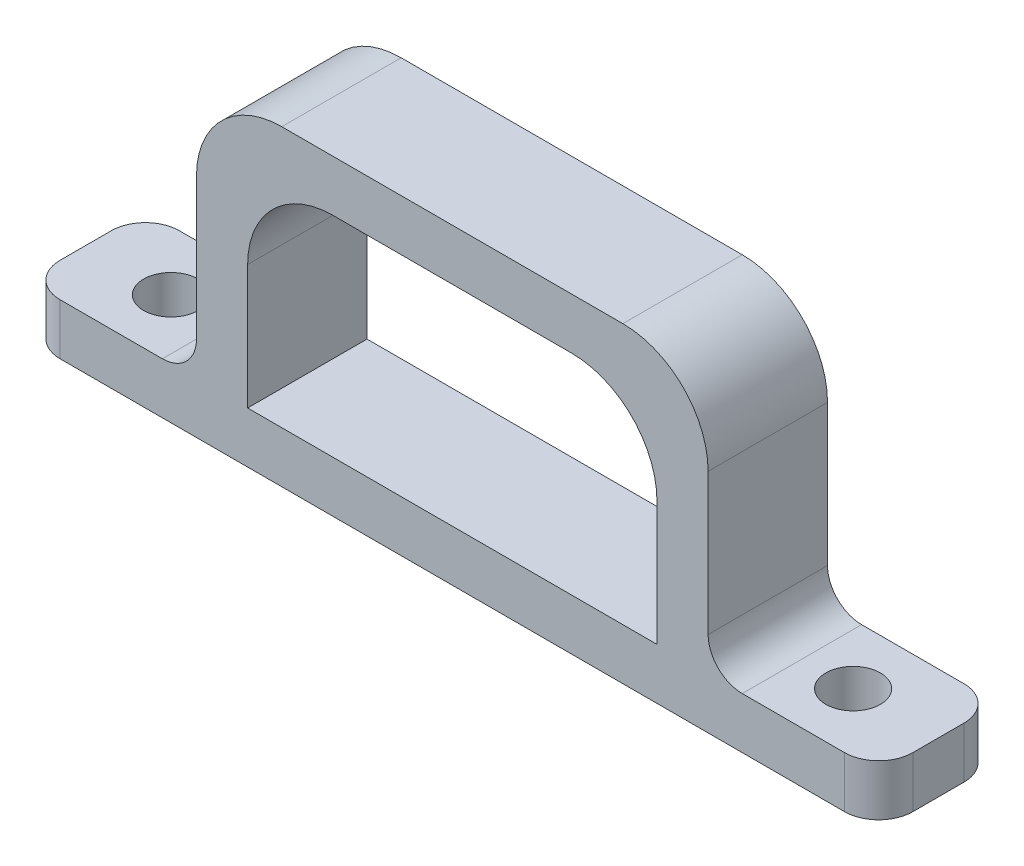
ISO-10303-21;
HEADER;
FILE_DESCRIPTION(('STEP AP214'),'2;1');
FILE_NAME('part.step','',(''),(''),'','','');
FILE_SCHEMA(('AUTOMOTIVE_DESIGN { 1 0 10303 214 1 1 1 1 }'));
ENDSEC;
DATA;
#1=APPLICATION_CONTEXT('core data for automotive mechanical design processes');
#2=APPLICATION_PROTOCOL_DEFINITION('international standard','automotive_design',2000,#1);
#3=PRODUCT_CONTEXT('',#1,'mechanical');
#4=PRODUCT('Part','Part','',(#3));
#5=PRODUCT_RELATED_PRODUCT_CATEGORY('part','',(#4));
#6=PRODUCT_DEFINITION_FORMATION('','',#4);
#7=PRODUCT_DEFINITION_CONTEXT('part definition',#1,'design');
#8=PRODUCT_DEFINITION('design','',#6,#7);
#9=PRODUCT_DEFINITION_SHAPE('','',#8);
#10=(LENGTH_UNIT() NAMED_UNIT(*) SI_UNIT(.MILLI.,.METRE.));
#11=(NAMED_UNIT(*) PLANE_ANGLE_UNIT() SI_UNIT($,.RADIAN.));
#12=(NAMED_UNIT(*) SI_UNIT($,.STERADIAN.) SOLID_ANGLE_UNIT());
#13=UNCERTAINTY_MEASURE_WITH_UNIT(LENGTH_MEASURE(1.E-05),#10,'distance_accuracy_value','');
#14=(GEOMETRIC_REPRESENTATION_CONTEXT(3) GLOBAL_UNCERTAINTY_ASSIGNED_CONTEXT((#13)) GLOBAL_UNIT_ASSIGNED_CONTEXT((#10,
#11,#12)) REPRESENTATION_CONTEXT('',''));
#15=CARTESIAN_POINT('',(0.,0.,0.));
#16=DIRECTION('',(0.,0.,1.));
#17=DIRECTION('',(1.,0.,0.));
#18=AXIS2_PLACEMENT_3D('',#15,#16,#17);
#19=CARTESIAN_POINT('',(0.,-1.5,7.));
#20=DIRECTION('',(0.,1.,0.));
#21=DIRECTION('',(0.,0.,1.));
#22=AXIS2_PLACEMENT_3D('',#19,#20,#21);
#23=PLANE('',#22);
#24=CARTESIAN_POINT('',(-20.,-1.5,3.5));
#25=DIRECTION('',(0.,1.,0.));
#26=DIRECTION('',(0.,0.,1.));
#27=AXIS2_PLACEMENT_3D('',#24,#25,#26);
#28=CIRCLE('',#27,1.6);
#29=CARTESIAN_POINT('',(-20.,-1.5,5.1));
#30=VERTEX_POINT('',#29);
#31=EDGE_CURVE('E731',#30,#30,#28,.T.);
#32=ORIENTED_EDGE('',*,*,#31,.T.);
#33=EDGE_LOOP('',(#32));
#34=FACE_BOUND('',#33,.T.);
#35=CARTESIAN_POINT('',(20.,-1.5,3.5));
#36=DIRECTION('',(0.,1.,0.));
#37=DIRECTION('',(0.,0.,1.));
#38=AXIS2_PLACEMENT_3D('',#35,#36,#37);
#39=CIRCLE('',#38,1.6);
#40=CARTESIAN_POINT('',(20.,-1.5,5.1));
#41=VERTEX_POINT('',#40);
#42=EDGE_CURVE('E267',#41,#41,#39,.T.);
#43=ORIENTED_EDGE('',*,*,#42,.T.);
#44=EDGE_LOOP('',(#43));
#45=FACE_BOUND('',#44,.T.);
#46=DIRECTION('',(1.,0.,0.));
#47=VECTOR('',#46,1.);
#48=CARTESIAN_POINT('',(0.,-1.5,0.));
#49=LINE('',#48,#47);
#50=CARTESIAN_POINT('',(-23.,-1.5,0.));
#51=VERTEX_POINT('',#50);
#52=CARTESIAN_POINT('',(23.,-1.5,0.));
#53=VERTEX_POINT('',#52);
#54=EDGE_CURVE('E278',#51,#53,#49,.T.);
#55=ORIENTED_EDGE('',*,*,#54,.T.);
#56=CARTESIAN_POINT('',(23.,-1.5,2.));
#57=DIRECTION('',(0.,1.,0.));
#58=DIRECTION('',(0.,0.,1.));
#59=AXIS2_PLACEMENT_3D('',#56,#57,#58);
#60=CIRCLE('',#59,2.);
#61=CARTESIAN_POINT('',(25.,-1.5,2.));
#62=VERTEX_POINT('',#61);
#63=EDGE_CURVE('E393',#53,#62,#60,.F.);
#64=ORIENTED_EDGE('',*,*,#63,.T.);
#65=DIRECTION('',(0.,0.,-1.));
#66=VECTOR('',#65,1.);
#67=CARTESIAN_POINT('',(25.,-1.5,7.));
#68=LINE('',#67,#66);
#69=CARTESIAN_POINT('',(25.,-1.5,5.));
#70=VERTEX_POINT('',#69);
#71=EDGE_CURVE('E301',#70,#62,#68,.T.);
#72=ORIENTED_EDGE('',*,*,#71,.F.);
#73=CARTESIAN_POINT('',(23.,-1.5,5.));
#74=DIRECTION('',(0.,1.,0.));
#75=DIRECTION('',(0.,0.,1.));
#76=AXIS2_PLACEMENT_3D('',#73,#74,#75);
#77=CIRCLE('',#76,2.);
#78=CARTESIAN_POINT('',(23.,-1.5,7.));
#79=VERTEX_POINT('',#78);
#80=EDGE_CURVE('E390',#70,#79,#77,.F.);
#81=ORIENTED_EDGE('',*,*,#80,.T.);
#82=DIRECTION('',(1.,0.,0.));
#83=VECTOR('',#82,1.);
#84=CARTESIAN_POINT('',(0.,-1.5,7.));
#85=LINE('',#84,#83);
#86=CARTESIAN_POINT('',(-23.,-1.5,7.));
#87=VERTEX_POINT('',#86);
#88=EDGE_CURVE('E244',#87,#79,#85,.T.);
#89=ORIENTED_EDGE('',*,*,#88,.F.);
#90=CARTESIAN_POINT('',(-23.,-1.5,5.));
#91=DIRECTION('',(0.,1.,0.));
#92=DIRECTION('',(0.,0.,1.));
#93=AXIS2_PLACEMENT_3D('',#90,#91,#92);
#94=CIRCLE('',#93,2.);
#95=CARTESIAN_POINT('',(-25.,-1.5,5.));
#96=VERTEX_POINT('',#95);
#97=EDGE_CURVE('E384',#87,#96,#94,.F.);
#98=ORIENTED_EDGE('',*,*,#97,.T.);
#99=DIRECTION('',(0.,0.,-1.));
#100=VECTOR('',#99,1.);
#101=CARTESIAN_POINT('',(-25.,-1.5,7.));
#102=LINE('',#101,#100);
#103=CARTESIAN_POINT('',(-25.,-1.5,2.));
#104=VERTEX_POINT('',#103);
#105=EDGE_CURVE('E210',#96,#104,#102,.T.);
#106=ORIENTED_EDGE('',*,*,#105,.T.);
#107=CARTESIAN_POINT('',(-23.,-1.5,2.));
#108=DIRECTION('',(0.,1.,0.));
#109=DIRECTION('',(0.,0.,1.));
#110=AXIS2_PLACEMENT_3D('',#107,#108,#109);
#111=CIRCLE('',#110,2.);
#112=EDGE_CURVE('E387',#104,#51,#111,.F.);
#113=ORIENTED_EDGE('',*,*,#112,.T.);
#114=EDGE_LOOP('',(#55,#64,#72,#81,#89,#98,#106,#113));
#115=FACE_BOUND('',#114,.T.);
#116=ADVANCED_FACE('F47',(#34,#45,#115),#23,.F.);
#117=CARTESIAN_POINT('',(25.,0.,7.));
#118=DIRECTION('',(-1.,0.,0.));
#119=DIRECTION('',(0.,0.,1.));
#120=AXIS2_PLACEMENT_3D('',#117,#118,#119);
#121=PLANE('',#120);
#122=ORIENTED_EDGE('',*,*,#71,.T.);
#123=DIRECTION('',(0.,1.,0.));
#124=VECTOR('',#123,1.);
#125=CARTESIAN_POINT('',(25.,0.,2.));
#126=LINE('',#125,#124);
#127=CARTESIAN_POINT('',(25.,1.5,2.));
#128=VERTEX_POINT('',#127);
#129=EDGE_CURVE('E364',#62,#128,#126,.T.);
#130=ORIENTED_EDGE('',*,*,#129,.T.);
#131=DIRECTION('',(0.,0.,-1.));
#132=VECTOR('',#131,1.);
#133=CARTESIAN_POINT('',(25.,1.5,7.));
#134=LINE('',#133,#132);
#135=CARTESIAN_POINT('',(25.,1.5,5.));
#136=VERTEX_POINT('',#135);
#137=EDGE_CURVE('E297',#136,#128,#134,.T.);
#138=ORIENTED_EDGE('',*,*,#137,.F.);
#139=DIRECTION('',(0.,1.,0.));
#140=VECTOR('',#139,1.);
#141=CARTESIAN_POINT('',(25.,-1.5,5.));
#142=LINE('',#141,#140);
#143=EDGE_CURVE('E361',#136,#70,#142,.F.);
#144=ORIENTED_EDGE('',*,*,#143,.T.);
#145=EDGE_LOOP('',(#122,#130,#138,#144));
#146=FACE_BOUND('',#145,.T.);
#147=ADVANCED_FACE('F464',(#146),#121,.F.);
#148=CARTESIAN_POINT('',(0.,1.5,7.));
#149=DIRECTION('',(0.,1.,0.));
#150=DIRECTION('',(0.,0.,1.));
#151=AXIS2_PLACEMENT_3D('',#148,#149,#150);
#152=PLANE('',#151);
#153=CARTESIAN_POINT('',(20.,1.5,3.5));
#154=DIRECTION('',(0.,1.,0.));
#155=DIRECTION('',(0.,0.,1.));
#156=AXIS2_PLACEMENT_3D('',#153,#154,#155);
#157=CIRCLE('',#156,1.6);
#158=CARTESIAN_POINT('',(20.,1.5,5.1));
#159=VERTEX_POINT('',#158);
#160=EDGE_CURVE('E714',#159,#159,#157,.T.);
#161=ORIENTED_EDGE('',*,*,#160,.F.);
#162=EDGE_LOOP('',(#161));
#163=FACE_BOUND('',#162,.T.);
#164=ORIENTED_EDGE('',*,*,#137,.T.);
#165=CARTESIAN_POINT('',(23.,1.5,2.));
#166=DIRECTION('',(0.,1.,0.));
#167=DIRECTION('',(0.,0.,1.));
#168=AXIS2_PLACEMENT_3D('',#165,#166,#167);
#169=CIRCLE('',#168,2.);
#170=CARTESIAN_POINT('',(23.,1.5,0.));
#171=VERTEX_POINT('',#170);
#172=EDGE_CURVE('E374',#128,#171,#169,.T.);
#173=ORIENTED_EDGE('',*,*,#172,.T.);
#174=DIRECTION('',(1.,0.,0.));
#175=VECTOR('',#174,1.);
#176=CARTESIAN_POINT('',(0.,1.5,0.));
#177=LINE('',#176,#175);
#178=CARTESIAN_POINT('',(17.,1.5,0.));
#179=VERTEX_POINT('',#178);
#180=EDGE_CURVE('E236',#179,#171,#177,.T.);
#181=ORIENTED_EDGE('',*,*,#180,.F.);
#182=DIRECTION('',(0.,0.,-1.));
#183=VECTOR('',#182,1.);
#184=CARTESIAN_POINT('',(17.,1.5,7.));
#185=LINE('',#184,#183);
#186=CARTESIAN_POINT('',(17.,1.5,7.));
#187=VERTEX_POINT('',#186);
#188=EDGE_CURVE('E368',#179,#187,#185,.F.);
#189=ORIENTED_EDGE('',*,*,#188,.T.);
#190=DIRECTION('',(1.,0.,0.));
#191=VECTOR('',#190,1.);
#192=CARTESIAN_POINT('',(0.,1.5,7.));
#193=LINE('',#192,#191);
#194=CARTESIAN_POINT('',(23.,1.5,7.));
#195=VERTEX_POINT('',#194);
#196=EDGE_CURVE('E231',#187,#195,#193,.T.);
#197=ORIENTED_EDGE('',*,*,#196,.T.);
#198=CARTESIAN_POINT('',(23.,1.5,5.));
#199=DIRECTION('',(0.,1.,0.));
#200=DIRECTION('',(0.,0.,1.));
#201=AXIS2_PLACEMENT_3D('',#198,#199,#200);
#202=CIRCLE('',#201,2.);
#203=EDGE_CURVE('E371',#195,#136,#202,.T.);
#204=ORIENTED_EDGE('',*,*,#203,.T.);
#205=EDGE_LOOP('',(#164,#173,#181,#189,#197,#204));
#206=FACE_BOUND('',#205,.T.);
#207=ADVANCED_FACE('F481',(#163,#206),#152,.T.);
#208=CARTESIAN_POINT('',(15.,0.,7.));
#209=DIRECTION('',(-1.,0.,0.));
#210=DIRECTION('',(0.,-1.,0.));
#211=AXIS2_PLACEMENT_3D('',#208,#209,#210);
#212=PLANE('',#211);
#213=DIRECTION('',(0.,1.,0.));
#214=VECTOR('',#213,1.);
#215=CARTESIAN_POINT('',(15.,0.,7.));
#216=LINE('',#215,#214);
#217=CARTESIAN_POINT('',(15.,3.5,7.));
#218=VERTEX_POINT('',#217);
#219=CARTESIAN_POINT('',(15.,11.7835913944263,7.));
#220=VERTEX_POINT('',#219);
#221=EDGE_CURVE('E243',#218,#220,#216,.T.);
#222=ORIENTED_EDGE('',*,*,#221,.F.);
#223=DIRECTION('',(0.,0.,-1.));
#224=VECTOR('',#223,1.);
#225=CARTESIAN_POINT('',(15.,3.5,7.));
#226=LINE('',#225,#224);
#227=CARTESIAN_POINT('',(15.,3.5,0.));
#228=VERTEX_POINT('',#227);
#229=EDGE_CURVE('E402',#218,#228,#226,.T.);
#230=ORIENTED_EDGE('',*,*,#229,.T.);
#231=DIRECTION('',(0.,1.,0.));
#232=VECTOR('',#231,1.);
#233=CARTESIAN_POINT('',(15.,0.,0.));
#234=LINE('',#233,#232);
#235=CARTESIAN_POINT('',(15.,11.7835913944263,0.));
#236=VERTEX_POINT('',#235);
#237=EDGE_CURVE('E282',#228,#236,#234,.T.);
#238=ORIENTED_EDGE('',*,*,#237,.T.);
#239=DIRECTION('',(0.,0.,-1.));
#240=VECTOR('',#239,1.);
#241=CARTESIAN_POINT('',(15.,11.7835913944263,7.));
#242=LINE('',#241,#240);
#243=EDGE_CURVE('E334',#236,#220,#242,.F.);
#244=ORIENTED_EDGE('',*,*,#243,.T.);
#245=EDGE_LOOP('',(#222,#230,#238,#244));
#246=FACE_BOUND('',#245,.T.);
#247=ADVANCED_FACE('F661',(#246),#212,.F.);
#248=CARTESIAN_POINT('',(0.,16.7835913944263,7.));
#249=DIRECTION('',(0.,1.,0.));
#250=DIRECTION('',(0.,0.,1.));
#251=AXIS2_PLACEMENT_3D('',#248,#249,#250);
#252=PLANE('',#251);
#253=DIRECTION('',(1.,0.,0.));
#254=VECTOR('',#253,1.);
#255=CARTESIAN_POINT('',(0.,16.7835913944263,7.));
#256=LINE('',#255,#254);
#257=CARTESIAN_POINT('',(-10.,16.7835913944263,7.));
#258=VERTEX_POINT('',#257);
#259=CARTESIAN_POINT('',(10.,16.7835913944263,7.));
#260=VERTEX_POINT('',#259);
#261=EDGE_CURVE('E249',#258,#260,#256,.T.);
#262=ORIENTED_EDGE('',*,*,#261,.T.);
#263=DIRECTION('',(0.,0.,-1.));
#264=VECTOR('',#263,1.);
#265=CARTESIAN_POINT('',(10.,16.7835913944263,0.));
#266=LINE('',#265,#264);
#267=CARTESIAN_POINT('',(10.,16.7835913944263,0.));
#268=VERTEX_POINT('',#267);
#269=EDGE_CURVE('E323',#260,#268,#266,.T.);
#270=ORIENTED_EDGE('',*,*,#269,.T.);
#271=DIRECTION('',(1.,0.,0.));
#272=VECTOR('',#271,1.);
#273=CARTESIAN_POINT('',(0.,16.7835913944263,0.));
#274=LINE('',#273,#272);
#275=CARTESIAN_POINT('',(-10.,16.7835913944263,0.));
#276=VERTEX_POINT('',#275);
#277=EDGE_CURVE('E285',#276,#268,#274,.T.);
#278=ORIENTED_EDGE('',*,*,#277,.F.);
#279=DIRECTION('',(0.,0.,-1.));
#280=VECTOR('',#279,1.);
#281=CARTESIAN_POINT('',(-10.,16.7835913944263,7.));
#282=LINE('',#281,#280);
#283=EDGE_CURVE('E320',#276,#258,#282,.F.);
#284=ORIENTED_EDGE('',*,*,#283,.T.);
#285=EDGE_LOOP('',(#262,#270,#278,#284));
#286=FACE_BOUND('',#285,.T.);
#287=ADVANCED_FACE('F653',(#286),#252,.T.);
#288=CARTESIAN_POINT('',(-15.,0.,7.));
#289=DIRECTION('',(-1.,0.,0.));
#290=DIRECTION('',(0.,0.,1.));
#291=AXIS2_PLACEMENT_3D('',#288,#289,#290);
#292=PLANE('',#291);
#293=DIRECTION('',(0.,1.,0.));
#294=VECTOR('',#293,1.);
#295=CARTESIAN_POINT('',(-15.,0.,0.));
#296=LINE('',#295,#294);
#297=CARTESIAN_POINT('',(-15.,3.5,0.));
#298=VERTEX_POINT('',#297);
#299=CARTESIAN_POINT('',(-15.,11.7835913944263,0.));
#300=VERTEX_POINT('',#299);
#301=EDGE_CURVE('E234',#298,#300,#296,.T.);
#302=ORIENTED_EDGE('',*,*,#301,.F.);
#303=DIRECTION('',(0.,0.,-1.));
#304=VECTOR('',#303,1.);
#305=CARTESIAN_POINT('',(-15.,3.5,7.));
#306=LINE('',#305,#304);
#307=CARTESIAN_POINT('',(-15.,3.5,7.));
#308=VERTEX_POINT('',#307);
#309=EDGE_CURVE('E414',#298,#308,#306,.F.);
#310=ORIENTED_EDGE('',*,*,#309,.T.);
#311=DIRECTION('',(0.,1.,0.));
#312=VECTOR('',#311,1.);
#313=CARTESIAN_POINT('',(-15.,0.,7.));
#314=LINE('',#313,#312);
#315=CARTESIAN_POINT('',(-15.,11.7835913944263,7.));
#316=VERTEX_POINT('',#315);
#317=EDGE_CURVE('E240',#308,#316,#314,.T.);
#318=ORIENTED_EDGE('',*,*,#317,.T.);
#319=DIRECTION('',(0.,0.,-1.));
#320=VECTOR('',#319,1.);
#321=CARTESIAN_POINT('',(-15.,11.7835913944263,7.));
#322=LINE('',#321,#320);
#323=EDGE_CURVE('E345',#316,#300,#322,.T.);
#324=ORIENTED_EDGE('',*,*,#323,.T.);
#325=EDGE_LOOP('',(#302,#310,#318,#324));
#326=FACE_BOUND('',#325,.T.);
#327=ADVANCED_FACE('F438',(#326),#292,.T.);
#328=CARTESIAN_POINT('',(-20.,1.5,3.5));
#329=DIRECTION('',(0.,1.,0.));
#330=DIRECTION('',(0.,0.,1.));
#331=AXIS2_PLACEMENT_3D('',#328,#329,#330);
#332=CIRCLE('',#331,1.6);
#333=CARTESIAN_POINT('',(-20.,1.5,5.1));
#334=VERTEX_POINT('',#333);
#335=EDGE_CURVE('E733',#334,#334,#332,.T.);
#336=ORIENTED_EDGE('',*,*,#335,.F.);
#337=EDGE_LOOP('',(#336));
#338=FACE_BOUND('',#337,.T.);
#339=CARTESIAN_POINT('',(-23.,1.5,7.));
#340=VERTEX_POINT('',#339);
#341=CARTESIAN_POINT('',(-17.,1.5,7.));
#342=VERTEX_POINT('',#341);
#343=EDGE_CURVE('E230',#340,#342,#193,.T.);
#344=ORIENTED_EDGE('',*,*,#343,.T.);
#345=DIRECTION('',(0.,0.,-1.));
#346=VECTOR('',#345,1.);
#347=CARTESIAN_POINT('',(-17.,1.5,0.));
#348=LINE('',#347,#346);
#349=CARTESIAN_POINT('',(-17.,1.5,0.));
#350=VERTEX_POINT('',#349);
#351=EDGE_CURVE('E410',#342,#350,#348,.T.);
#352=ORIENTED_EDGE('',*,*,#351,.T.);
#353=CARTESIAN_POINT('',(-23.,1.5,0.));
#354=VERTEX_POINT('',#353);
#355=EDGE_CURVE('E228',#354,#350,#177,.T.);
#356=ORIENTED_EDGE('',*,*,#355,.F.);
#357=CARTESIAN_POINT('',(-23.,1.5,2.));
#358=DIRECTION('',(0.,1.,0.));
#359=DIRECTION('',(0.,0.,1.));
#360=AXIS2_PLACEMENT_3D('',#357,#358,#359);
#361=CIRCLE('',#360,2.);
#362=CARTESIAN_POINT('',(-25.,1.5,2.));
#363=VERTEX_POINT('',#362);
#364=EDGE_CURVE('E63',#354,#363,#361,.T.);
#365=ORIENTED_EDGE('',*,*,#364,.T.);
#366=DIRECTION('',(0.,0.,-1.));
#367=VECTOR('',#366,1.);
#368=CARTESIAN_POINT('',(-25.,1.5,7.));
#369=LINE('',#368,#367);
#370=CARTESIAN_POINT('',(-25.,1.5,5.));
#371=VERTEX_POINT('',#370);
#372=EDGE_CURVE('E294',#371,#363,#369,.T.);
#373=ORIENTED_EDGE('',*,*,#372,.F.);
#374=CARTESIAN_POINT('',(-23.,1.5,5.));
#375=DIRECTION('',(0.,1.,0.));
#376=DIRECTION('',(0.,0.,1.));
#377=AXIS2_PLACEMENT_3D('',#374,#375,#376);
#378=CIRCLE('',#377,2.);
#379=EDGE_CURVE('E71',#371,#340,#378,.T.);
#380=ORIENTED_EDGE('',*,*,#379,.T.);
#381=EDGE_LOOP('',(#344,#352,#356,#365,#373,#380));
#382=FACE_BOUND('',#381,.T.);
#383=ADVANCED_FACE('F444',(#338,#382),#152,.T.);
#384=CARTESIAN_POINT('',(-12.,1.5,0.));
#385=VERTEX_POINT('',#384);
#386=CARTESIAN_POINT('',(12.,1.5,0.));
#387=VERTEX_POINT('',#386);
#388=EDGE_CURVE('E205',#385,#387,#177,.T.);
#389=ORIENTED_EDGE('',*,*,#388,.F.);
#390=DIRECTION('',(0.,0.,-1.));
#391=VECTOR('',#390,1.);
#392=CARTESIAN_POINT('',(-12.,1.5,7.));
#393=LINE('',#392,#391);
#394=CARTESIAN_POINT('',(-12.,1.5,7.));
#395=VERTEX_POINT('',#394);
#396=EDGE_CURVE('E198',#395,#385,#393,.T.);
#397=ORIENTED_EDGE('',*,*,#396,.F.);
#398=CARTESIAN_POINT('',(12.,1.5,7.));
#399=VERTEX_POINT('',#398);
#400=EDGE_CURVE('E202',#395,#399,#193,.T.);
#401=ORIENTED_EDGE('',*,*,#400,.T.);
#402=DIRECTION('',(0.,0.,-1.));
#403=VECTOR('',#402,1.);
#404=CARTESIAN_POINT('',(12.,1.5,7.));
#405=LINE('',#404,#403);
#406=EDGE_CURVE('E211',#399,#387,#405,.T.);
#407=ORIENTED_EDGE('',*,*,#406,.T.);
#408=EDGE_LOOP('',(#389,#397,#401,#407));
#409=FACE_BOUND('',#408,.T.);
#410=ADVANCED_FACE('F200',(#409),#152,.T.);
#411=CARTESIAN_POINT('',(-12.,0.,7.));
#412=DIRECTION('',(-1.,0.,0.));
#413=DIRECTION('',(0.,0.,1.));
#414=AXIS2_PLACEMENT_3D('',#411,#412,#413);
#415=PLANE('',#414);
#416=DIRECTION('',(0.,1.,0.));
#417=VECTOR('',#416,1.);
#418=CARTESIAN_POINT('',(-12.,0.,0.));
#419=LINE('',#418,#417);
#420=CARTESIAN_POINT('',(-12.,8.78359139442625,0.));
#421=VERTEX_POINT('',#420);
#422=EDGE_CURVE('E266',#385,#421,#419,.T.);
#423=ORIENTED_EDGE('',*,*,#422,.T.);
#424=DIRECTION('',(0.,0.,-1.));
#425=VECTOR('',#424,1.);
#426=CARTESIAN_POINT('',(-12.,8.78359139442625,7.));
#427=LINE('',#426,#425);
#428=CARTESIAN_POINT('',(-12.,8.78359139442625,7.));
#429=VERTEX_POINT('',#428);
#430=EDGE_CURVE('E217',#421,#429,#427,.F.);
#431=ORIENTED_EDGE('',*,*,#430,.T.);
#432=DIRECTION('',(0.,1.,0.));
#433=VECTOR('',#432,1.);
#434=CARTESIAN_POINT('',(-12.,0.,7.));
#435=LINE('',#434,#433);
#436=EDGE_CURVE('E214',#395,#429,#435,.T.);
#437=ORIENTED_EDGE('',*,*,#436,.F.);
#438=ORIENTED_EDGE('',*,*,#396,.T.);
#439=EDGE_LOOP('',(#423,#431,#437,#438));
#440=FACE_BOUND('',#439,.T.);
#441=ADVANCED_FACE('F215',(#440),#415,.F.);
#442=CARTESIAN_POINT('',(0.,13.7835913944263,7.));
#443=DIRECTION('',(0.,1.,0.));
#444=DIRECTION('',(0.,0.,1.));
#445=AXIS2_PLACEMENT_3D('',#442,#443,#444);
#446=PLANE('',#445);
#447=DIRECTION('',(1.,0.,0.));
#448=VECTOR('',#447,1.);
#449=CARTESIAN_POINT('',(0.,13.7835913944263,7.));
#450=LINE('',#449,#448);
#451=CARTESIAN_POINT('',(-7.,13.7835913944263,7.));
#452=VERTEX_POINT('',#451);
#453=CARTESIAN_POINT('',(7.,13.7835913944263,7.));
#454=VERTEX_POINT('',#453);
#455=EDGE_CURVE('E221',#452,#454,#450,.T.);
#456=ORIENTED_EDGE('',*,*,#455,.F.);
#457=DIRECTION('',(0.,0.,-1.));
#458=VECTOR('',#457,1.);
#459=CARTESIAN_POINT('',(-7.,13.7835913944263,0.));
#460=LINE('',#459,#458);
#461=CARTESIAN_POINT('',(-7.,13.7835913944263,0.));
#462=VERTEX_POINT('',#461);
#463=EDGE_CURVE('E310',#452,#462,#460,.T.);
#464=ORIENTED_EDGE('',*,*,#463,.T.);
#465=DIRECTION('',(1.,0.,0.));
#466=VECTOR('',#465,1.);
#467=CARTESIAN_POINT('',(0.,13.7835913944263,0.));
#468=LINE('',#467,#466);
#469=CARTESIAN_POINT('',(7.,13.7835913944263,0.));
#470=VERTEX_POINT('',#469);
#471=EDGE_CURVE('E270',#462,#470,#468,.T.);
#472=ORIENTED_EDGE('',*,*,#471,.T.);
#473=DIRECTION('',(0.,0.,-1.));
#474=VECTOR('',#473,1.);
#475=CARTESIAN_POINT('',(7.,13.7835913944263,7.));
#476=LINE('',#475,#474);
#477=EDGE_CURVE('E305',#470,#454,#476,.F.);
#478=ORIENTED_EDGE('',*,*,#477,.T.);
#479=EDGE_LOOP('',(#456,#464,#472,#478));
#480=FACE_BOUND('',#479,.T.);
#481=ADVANCED_FACE('F490',(#480),#446,.F.);
#482=CARTESIAN_POINT('',(12.,0.,7.));
#483=DIRECTION('',(-1.,0.,0.));
#484=DIRECTION('',(0.,0.,1.));
#485=AXIS2_PLACEMENT_3D('',#482,#483,#484);
#486=PLANE('',#485);
#487=DIRECTION('',(0.,1.,0.));
#488=VECTOR('',#487,1.);
#489=CARTESIAN_POINT('',(12.,0.,7.));
#490=LINE('',#489,#488);
#491=CARTESIAN_POINT('',(12.,8.78359139442625,7.));
#492=VERTEX_POINT('',#491);
#493=EDGE_CURVE('E226',#399,#492,#490,.T.);
#494=ORIENTED_EDGE('',*,*,#493,.T.);
#495=DIRECTION('',(0.,0.,-1.));
#496=VECTOR('',#495,1.);
#497=CARTESIAN_POINT('',(12.,8.78359139442625,7.));
#498=LINE('',#497,#496);
#499=CARTESIAN_POINT('',(12.,8.78359139442625,0.));
#500=VERTEX_POINT('',#499);
#501=EDGE_CURVE('E316',#492,#500,#498,.T.);
#502=ORIENTED_EDGE('',*,*,#501,.T.);
#503=DIRECTION('',(0.,1.,0.));
#504=VECTOR('',#503,1.);
#505=CARTESIAN_POINT('',(12.,0.,0.));
#506=LINE('',#505,#504);
#507=EDGE_CURVE('E274',#387,#500,#506,.T.);
#508=ORIENTED_EDGE('',*,*,#507,.F.);
#509=ORIENTED_EDGE('',*,*,#406,.F.);
#510=EDGE_LOOP('',(#494,#502,#508,#509));
#511=FACE_BOUND('',#510,.T.);
#512=ADVANCED_FACE('F487',(#511),#486,.T.);
#513=CARTESIAN_POINT('',(-25.,0.,7.));
#514=DIRECTION('',(-1.,0.,0.));
#515=DIRECTION('',(0.,0.,1.));
#516=AXIS2_PLACEMENT_3D('',#513,#514,#515);
#517=PLANE('',#516);
#518=ORIENTED_EDGE('',*,*,#372,.T.);
#519=DIRECTION('',(0.,1.,0.));
#520=VECTOR('',#519,1.);
#521=CARTESIAN_POINT('',(-25.,-1.5,2.));
#522=LINE('',#521,#520);
#523=EDGE_CURVE('E420',#363,#104,#522,.F.);
#524=ORIENTED_EDGE('',*,*,#523,.T.);
#525=ORIENTED_EDGE('',*,*,#105,.F.);
#526=DIRECTION('',(0.,1.,0.));
#527=VECTOR('',#526,1.);
#528=CARTESIAN_POINT('',(-25.,0.,5.));
#529=LINE('',#528,#527);
#530=EDGE_CURVE('E417',#96,#371,#529,.T.);
#531=ORIENTED_EDGE('',*,*,#530,.T.);
#532=EDGE_LOOP('',(#518,#524,#525,#531));
#533=FACE_BOUND('',#532,.T.);
#534=ADVANCED_FACE('F447',(#533),#517,.T.);
#535=CARTESIAN_POINT('',(0.,0.,7.));
#536=DIRECTION('',(0.,0.,1.));
#537=DIRECTION('',(1.,0.,0.));
#538=AXIS2_PLACEMENT_3D('',#535,#536,#537);
#539=PLANE('',#538);
#540=ORIENTED_EDGE('',*,*,#400,.F.);
#541=ORIENTED_EDGE('',*,*,#436,.T.);
#542=CARTESIAN_POINT('',(-7.,8.78359139442625,7.));
#543=DIRECTION('',(0.,0.,1.));
#544=DIRECTION('',(1.,0.,0.));
#545=AXIS2_PLACEMENT_3D('',#542,#543,#544);
#546=CIRCLE('',#545,5.);
#547=EDGE_CURVE('E352',#429,#452,#546,.F.);
#548=ORIENTED_EDGE('',*,*,#547,.T.);
#549=ORIENTED_EDGE('',*,*,#455,.T.);
#550=CARTESIAN_POINT('',(7.,8.78359139442625,7.));
#551=DIRECTION('',(0.,0.,1.));
#552=DIRECTION('',(1.,0.,0.));
#553=AXIS2_PLACEMENT_3D('',#550,#551,#552);
#554=CIRCLE('',#553,5.);
#555=EDGE_CURVE('E358',#454,#492,#554,.F.);
#556=ORIENTED_EDGE('',*,*,#555,.T.);
#557=ORIENTED_EDGE('',*,*,#493,.F.);
#558=EDGE_LOOP('',(#540,#541,#548,#549,#556,#557));
#559=FACE_BOUND('',#558,.T.);
#560=ORIENTED_EDGE('',*,*,#88,.T.);
#561=DIRECTION('',(0.,1.,0.));
#562=VECTOR('',#561,1.);
#563=CARTESIAN_POINT('',(23.,1.5,7.));
#564=LINE('',#563,#562);
#565=EDGE_CURVE('E399',#79,#195,#564,.T.);
#566=ORIENTED_EDGE('',*,*,#565,.T.);
#567=ORIENTED_EDGE('',*,*,#196,.F.);
#568=CARTESIAN_POINT('',(17.,3.5,7.));
#569=DIRECTION('',(0.,0.,1.));
#570=DIRECTION('',(1.,0.,0.));
#571=AXIS2_PLACEMENT_3D('',#568,#569,#570);
#572=CIRCLE('',#571,2.);
#573=EDGE_CURVE('E426',#187,#218,#572,.F.);
#574=ORIENTED_EDGE('',*,*,#573,.T.);
#575=ORIENTED_EDGE('',*,*,#221,.T.);
#576=CARTESIAN_POINT('',(10.,11.7835913944263,7.));
#577=DIRECTION('',(0.,0.,1.));
#578=DIRECTION('',(1.,0.,0.));
#579=AXIS2_PLACEMENT_3D('',#576,#577,#578);
#580=CIRCLE('',#579,5.);
#581=EDGE_CURVE('E342',#220,#260,#580,.T.);
#582=ORIENTED_EDGE('',*,*,#581,.T.);
#583=ORIENTED_EDGE('',*,*,#261,.F.);
#584=CARTESIAN_POINT('',(-10.,11.7835913944263,7.));
#585=DIRECTION('',(0.,0.,1.));
#586=DIRECTION('',(1.,0.,0.));
#587=AXIS2_PLACEMENT_3D('',#584,#585,#586);
#588=CIRCLE('',#587,5.);
#589=EDGE_CURVE('E338',#258,#316,#588,.T.);
#590=ORIENTED_EDGE('',*,*,#589,.T.);
#591=ORIENTED_EDGE('',*,*,#317,.F.);
#592=CARTESIAN_POINT('',(-17.,3.5,7.));
#593=DIRECTION('',(0.,0.,1.));
#594=DIRECTION('',(1.,0.,0.));
#595=AXIS2_PLACEMENT_3D('',#592,#593,#594);
#596=CIRCLE('',#595,2.);
#597=EDGE_CURVE('E11',#308,#342,#596,.F.);
#598=ORIENTED_EDGE('',*,*,#597,.T.);
#599=ORIENTED_EDGE('',*,*,#343,.F.);
#600=DIRECTION('',(0.,1.,0.));
#601=VECTOR('',#600,1.);
#602=CARTESIAN_POINT('',(-23.,0.,7.));
#603=LINE('',#602,#601);
#604=EDGE_CURVE('E396',#340,#87,#603,.F.);
#605=ORIENTED_EDGE('',*,*,#604,.T.);
#606=EDGE_LOOP('',(#560,#566,#567,#574,#575,#582,#583,#590,#591,#598,#599,#605));
#607=FACE_BOUND('',#606,.T.);
#608=ADVANCED_FACE('F223',(#559,#607),#539,.T.);
#609=CARTESIAN_POINT('',(0.,0.,0.));
#610=DIRECTION('',(0.,0.,1.));
#611=DIRECTION('',(1.,0.,0.));
#612=AXIS2_PLACEMENT_3D('',#609,#610,#611);
#613=PLANE('',#612);
#614=ORIENTED_EDGE('',*,*,#388,.T.);
#615=ORIENTED_EDGE('',*,*,#507,.T.);
#616=CARTESIAN_POINT('',(7.,8.78359139442625,0.));
#617=DIRECTION('',(0.,0.,1.));
#618=DIRECTION('',(1.,0.,0.));
#619=AXIS2_PLACEMENT_3D('',#616,#617,#618);
#620=CIRCLE('',#619,5.);
#621=EDGE_CURVE('E355',#500,#470,#620,.T.);
#622=ORIENTED_EDGE('',*,*,#621,.T.);
#623=ORIENTED_EDGE('',*,*,#471,.F.);
#624=CARTESIAN_POINT('',(-7.,8.78359139442625,0.));
#625=DIRECTION('',(0.,0.,1.));
#626=DIRECTION('',(1.,0.,0.));
#627=AXIS2_PLACEMENT_3D('',#624,#625,#626);
#628=CIRCLE('',#627,5.);
#629=EDGE_CURVE('E349',#462,#421,#628,.T.);
#630=ORIENTED_EDGE('',*,*,#629,.T.);
#631=ORIENTED_EDGE('',*,*,#422,.F.);
#632=EDGE_LOOP('',(#614,#615,#622,#623,#630,#631));
#633=FACE_BOUND('',#632,.T.);
#634=ORIENTED_EDGE('',*,*,#180,.T.);
#635=DIRECTION('',(0.,1.,0.));
#636=VECTOR('',#635,1.);
#637=CARTESIAN_POINT('',(23.,0.,0.));
#638=LINE('',#637,#636);
#639=EDGE_CURVE('E381',#171,#53,#638,.F.);
#640=ORIENTED_EDGE('',*,*,#639,.T.);
#641=ORIENTED_EDGE('',*,*,#54,.F.);
#642=DIRECTION('',(0.,1.,0.));
#643=VECTOR('',#642,1.);
#644=CARTESIAN_POINT('',(-23.,1.5,0.));
#645=LINE('',#644,#643);
#646=EDGE_CURVE('E377',#51,#354,#645,.T.);
#647=ORIENTED_EDGE('',*,*,#646,.T.);
#648=ORIENTED_EDGE('',*,*,#355,.T.);
#649=CARTESIAN_POINT('',(-17.,3.5,0.));
#650=DIRECTION('',(0.,0.,1.));
#651=DIRECTION('',(1.,0.,0.));
#652=AXIS2_PLACEMENT_3D('',#649,#650,#651);
#653=CIRCLE('',#652,2.);
#654=EDGE_CURVE('E56',#350,#298,#653,.T.);
#655=ORIENTED_EDGE('',*,*,#654,.T.);
#656=ORIENTED_EDGE('',*,*,#301,.T.);
#657=CARTESIAN_POINT('',(-10.,11.7835913944263,0.));
#658=DIRECTION('',(0.,0.,1.));
#659=DIRECTION('',(1.,0.,0.));
#660=AXIS2_PLACEMENT_3D('',#657,#658,#659);
#661=CIRCLE('',#660,5.);
#662=EDGE_CURVE('E327',#300,#276,#661,.F.);
#663=ORIENTED_EDGE('',*,*,#662,.T.);
#664=ORIENTED_EDGE('',*,*,#277,.T.);
#665=CARTESIAN_POINT('',(10.,11.7835913944263,0.));
#666=DIRECTION('',(0.,0.,1.));
#667=DIRECTION('',(1.,0.,0.));
#668=AXIS2_PLACEMENT_3D('',#665,#666,#667);
#669=CIRCLE('',#668,5.);
#670=EDGE_CURVE('E330',#268,#236,#669,.F.);
#671=ORIENTED_EDGE('',*,*,#670,.T.);
#672=ORIENTED_EDGE('',*,*,#237,.F.);
#673=CARTESIAN_POINT('',(17.,3.5,0.));
#674=DIRECTION('',(0.,0.,1.));
#675=DIRECTION('',(1.,0.,0.));
#676=AXIS2_PLACEMENT_3D('',#673,#674,#675);
#677=CIRCLE('',#676,2.);
#678=EDGE_CURVE('E423',#228,#179,#677,.T.);
#679=ORIENTED_EDGE('',*,*,#678,.T.);
#680=EDGE_LOOP('',(#634,#640,#641,#647,#648,#655,#656,#663,#664,#671,#672,#679));
#681=FACE_BOUND('',#680,.T.);
#682=ADVANCED_FACE('F432',(#633,#681),#613,.F.);
#683=CARTESIAN_POINT('',(-20.,-5.5,3.5));
#684=DIRECTION('',(0.,1.,0.));
#685=DIRECTION('',(0.,0.,1.));
#686=AXIS2_PLACEMENT_3D('',#683,#684,#685);
#687=CYLINDRICAL_SURFACE('',#686,1.6);
#688=ORIENTED_EDGE('',*,*,#335,.T.);
#689=EDGE_LOOP('',(#688));
#690=FACE_BOUND('',#689,.T.);
#691=ORIENTED_EDGE('',*,*,#31,.F.);
#692=EDGE_LOOP('',(#691));
#693=FACE_BOUND('',#692,.T.);
#694=ADVANCED_FACE('F579',(#690,#693),#687,.F.);
#695=CARTESIAN_POINT('',(20.,-5.5,3.5));
#696=DIRECTION('',(0.,1.,0.));
#697=DIRECTION('',(0.,0.,1.));
#698=AXIS2_PLACEMENT_3D('',#695,#696,#697);
#699=CYLINDRICAL_SURFACE('',#698,1.6);
#700=ORIENTED_EDGE('',*,*,#160,.T.);
#701=EDGE_LOOP('',(#700));
#702=FACE_BOUND('',#701,.T.);
#703=ORIENTED_EDGE('',*,*,#42,.F.);
#704=EDGE_LOOP('',(#703));
#705=FACE_BOUND('',#704,.T.);
#706=ADVANCED_FACE('F501',(#702,#705),#699,.F.);
#707=CARTESIAN_POINT('',(-7.,8.78359139442625,7.));
#708=DIRECTION('',(0.,0.,1.));
#709=DIRECTION('',(1.,0.,0.));
#710=AXIS2_PLACEMENT_3D('',#707,#708,#709);
#711=CYLINDRICAL_SURFACE('',#710,5.);
#712=ORIENTED_EDGE('',*,*,#547,.F.);
#713=ORIENTED_EDGE('',*,*,#430,.F.);
#714=ORIENTED_EDGE('',*,*,#629,.F.);
#715=ORIENTED_EDGE('',*,*,#463,.F.);
#716=EDGE_LOOP('',(#712,#713,#714,#715));
#717=FACE_BOUND('',#716,.T.);
#718=ADVANCED_FACE('F497',(#717),#711,.F.);
#719=CARTESIAN_POINT('',(7.,8.78359139442625,7.));
#720=DIRECTION('',(0.,0.,-1.));
#721=DIRECTION('',(-1.,0.,0.));
#722=AXIS2_PLACEMENT_3D('',#719,#720,#721);
#723=CYLINDRICAL_SURFACE('',#722,5.);
#724=ORIENTED_EDGE('',*,*,#555,.F.);
#725=ORIENTED_EDGE('',*,*,#477,.F.);
#726=ORIENTED_EDGE('',*,*,#621,.F.);
#727=ORIENTED_EDGE('',*,*,#501,.F.);
#728=EDGE_LOOP('',(#724,#725,#726,#727));
#729=FACE_BOUND('',#728,.T.);
#730=ADVANCED_FACE('F500',(#729),#723,.F.);
#731=CARTESIAN_POINT('',(10.,11.7835913944263,7.));
#732=DIRECTION('',(0.,0.,1.));
#733=DIRECTION('',(1.,0.,0.));
#734=AXIS2_PLACEMENT_3D('',#731,#732,#733);
#735=CYLINDRICAL_SURFACE('',#734,5.);
#736=ORIENTED_EDGE('',*,*,#581,.F.);
#737=ORIENTED_EDGE('',*,*,#243,.F.);
#738=ORIENTED_EDGE('',*,*,#670,.F.);
#739=ORIENTED_EDGE('',*,*,#269,.F.);
#740=EDGE_LOOP('',(#736,#737,#738,#739));
#741=FACE_BOUND('',#740,.T.);
#742=ADVANCED_FACE('F505',(#741),#735,.T.);
#743=CARTESIAN_POINT('',(-10.,11.7835913944263,7.));
#744=DIRECTION('',(0.,0.,-1.));
#745=DIRECTION('',(-1.,0.,0.));
#746=AXIS2_PLACEMENT_3D('',#743,#744,#745);
#747=CYLINDRICAL_SURFACE('',#746,5.);
#748=ORIENTED_EDGE('',*,*,#589,.F.);
#749=ORIENTED_EDGE('',*,*,#283,.F.);
#750=ORIENTED_EDGE('',*,*,#662,.F.);
#751=ORIENTED_EDGE('',*,*,#323,.F.);
#752=EDGE_LOOP('',(#748,#749,#750,#751));
#753=FACE_BOUND('',#752,.T.);
#754=ADVANCED_FACE('F509',(#753),#747,.T.);
#755=CARTESIAN_POINT('',(23.,0.,2.));
#756=DIRECTION('',(0.,1.,0.));
#757=DIRECTION('',(0.,0.,1.));
#758=AXIS2_PLACEMENT_3D('',#755,#756,#757);
#759=CYLINDRICAL_SURFACE('',#758,2.);
#760=ORIENTED_EDGE('',*,*,#63,.F.);
#761=ORIENTED_EDGE('',*,*,#639,.F.);
#762=ORIENTED_EDGE('',*,*,#172,.F.);
#763=ORIENTED_EDGE('',*,*,#129,.F.);
#764=EDGE_LOOP('',(#760,#761,#762,#763));
#765=FACE_BOUND('',#764,.T.);
#766=ADVANCED_FACE('F459',(#765),#759,.T.);
#767=CARTESIAN_POINT('',(23.,0.,5.));
#768=DIRECTION('',(0.,-1.,0.));
#769=DIRECTION('',(0.,0.,-1.));
#770=AXIS2_PLACEMENT_3D('',#767,#768,#769);
#771=CYLINDRICAL_SURFACE('',#770,2.);
#772=ORIENTED_EDGE('',*,*,#80,.F.);
#773=ORIENTED_EDGE('',*,*,#143,.F.);
#774=ORIENTED_EDGE('',*,*,#203,.F.);
#775=ORIENTED_EDGE('',*,*,#565,.F.);
#776=EDGE_LOOP('',(#772,#773,#774,#775));
#777=FACE_BOUND('',#776,.T.);
#778=ADVANCED_FACE('F468',(#777),#771,.T.);
#779=CARTESIAN_POINT('',(17.,3.5,7.));
#780=DIRECTION('',(0.,0.,-1.));
#781=DIRECTION('',(-1.,0.,0.));
#782=AXIS2_PLACEMENT_3D('',#779,#780,#781);
#783=CYLINDRICAL_SURFACE('',#782,2.);
#784=ORIENTED_EDGE('',*,*,#573,.F.);
#785=ORIENTED_EDGE('',*,*,#188,.F.);
#786=ORIENTED_EDGE('',*,*,#678,.F.);
#787=ORIENTED_EDGE('',*,*,#229,.F.);
#788=EDGE_LOOP('',(#784,#785,#786,#787));
#789=FACE_BOUND('',#788,.T.);
#790=ADVANCED_FACE('F517',(#789),#783,.F.);
#791=CARTESIAN_POINT('',(-17.,3.5,7.));
#792=DIRECTION('',(0.,0.,1.));
#793=DIRECTION('',(1.,0.,0.));
#794=AXIS2_PLACEMENT_3D('',#791,#792,#793);
#795=CYLINDRICAL_SURFACE('',#794,2.);
#796=ORIENTED_EDGE('',*,*,#597,.F.);
#797=ORIENTED_EDGE('',*,*,#309,.F.);
#798=ORIENTED_EDGE('',*,*,#654,.F.);
#799=ORIENTED_EDGE('',*,*,#351,.F.);
#800=EDGE_LOOP('',(#796,#797,#798,#799));
#801=FACE_BOUND('',#800,.T.);
#802=ADVANCED_FACE('F442',(#801),#795,.F.);
#803=CARTESIAN_POINT('',(-23.,0.,2.));
#804=DIRECTION('',(0.,-1.,0.));
#805=DIRECTION('',(0.,0.,-1.));
#806=AXIS2_PLACEMENT_3D('',#803,#804,#805);
#807=CYLINDRICAL_SURFACE('',#806,2.);
#808=ORIENTED_EDGE('',*,*,#112,.F.);
#809=ORIENTED_EDGE('',*,*,#523,.F.);
#810=ORIENTED_EDGE('',*,*,#364,.F.);
#811=ORIENTED_EDGE('',*,*,#646,.F.);
#812=EDGE_LOOP('',(#808,#809,#810,#811));
#813=FACE_BOUND('',#812,.T.);
#814=ADVANCED_FACE('F451',(#813),#807,.T.);
#815=CARTESIAN_POINT('',(-23.,0.,5.));
#816=DIRECTION('',(0.,1.,0.));
#817=DIRECTION('',(0.,0.,1.));
#818=AXIS2_PLACEMENT_3D('',#815,#816,#817);
#819=CYLINDRICAL_SURFACE('',#818,2.);
#820=ORIENTED_EDGE('',*,*,#97,.F.);
#821=ORIENTED_EDGE('',*,*,#604,.F.);
#822=ORIENTED_EDGE('',*,*,#379,.F.);
#823=ORIENTED_EDGE('',*,*,#530,.F.);
#824=EDGE_LOOP('',(#820,#821,#822,#823));
#825=FACE_BOUND('',#824,.T.);
#826=ADVANCED_FACE('F49',(#825),#819,.T.);
#827=CLOSED_SHELL('',(#116,#147,#207,#247,#287,#327,#383,#410,#441,#481,#512,#534,#608,#682,
#694,#706,#718,#730,#742,#754,#766,#778,#790,#802,#814,#826));
#828=MANIFOLD_SOLID_BREP('B2',#827);
#829=ADVANCED_BREP_SHAPE_REPRESENTATION('',(#18,#828),#14);
#830=SHAPE_DEFINITION_REPRESENTATION(#9,#829);
ENDSEC;
END-ISO-10303-21;
